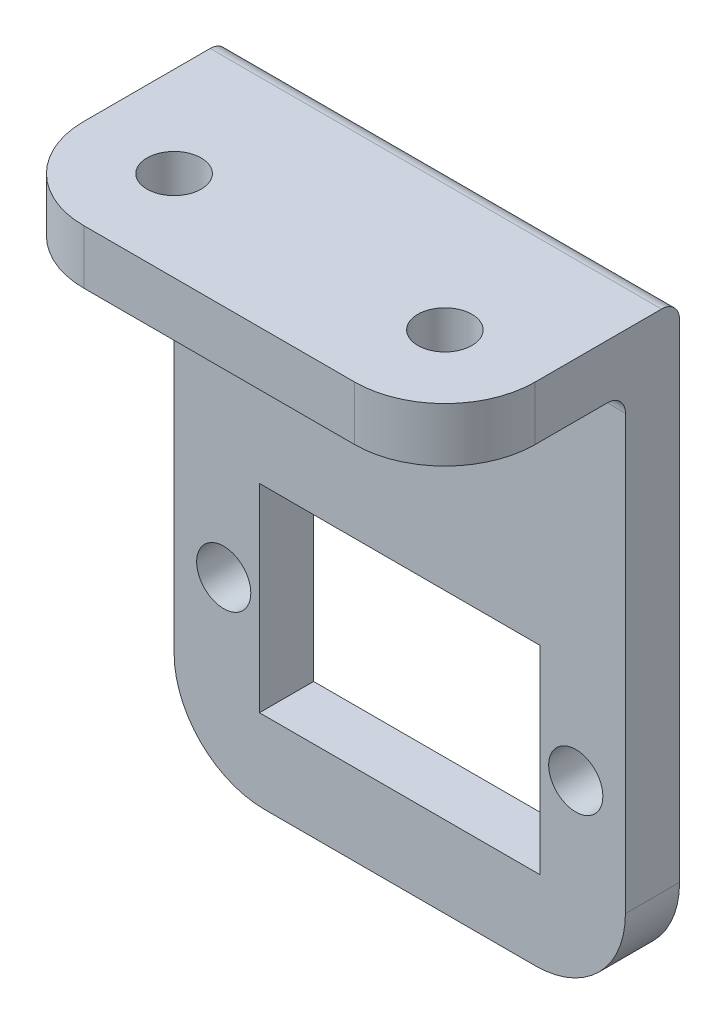
ISO-10303-21;
HEADER;
FILE_DESCRIPTION(('STEP AP214'),'2;1');
FILE_NAME('part.step','',(''),(''),'','','');
FILE_SCHEMA(('AUTOMOTIVE_DESIGN { 1 0 10303 214 1 1 1 1 }'));
ENDSEC;
DATA;
#1=APPLICATION_CONTEXT('core data for automotive mechanical design processes');
#2=APPLICATION_PROTOCOL_DEFINITION('international standard','automotive_design',2000,#1);
#3=PRODUCT_CONTEXT('',#1,'mechanical');
#4=PRODUCT('Part','Part','',(#3));
#5=PRODUCT_RELATED_PRODUCT_CATEGORY('part','',(#4));
#6=PRODUCT_DEFINITION_FORMATION('','',#4);
#7=PRODUCT_DEFINITION_CONTEXT('part definition',#1,'design');
#8=PRODUCT_DEFINITION('design','',#6,#7);
#9=PRODUCT_DEFINITION_SHAPE('','',#8);
#10=(LENGTH_UNIT() NAMED_UNIT(*) SI_UNIT(.MILLI.,.METRE.));
#11=(NAMED_UNIT(*) PLANE_ANGLE_UNIT() SI_UNIT($,.RADIAN.));
#12=(NAMED_UNIT(*) SI_UNIT($,.STERADIAN.) SOLID_ANGLE_UNIT());
#13=UNCERTAINTY_MEASURE_WITH_UNIT(LENGTH_MEASURE(1.E-05),#10,'distance_accuracy_value','');
#14=(GEOMETRIC_REPRESENTATION_CONTEXT(3) GLOBAL_UNCERTAINTY_ASSIGNED_CONTEXT((#13)) GLOBAL_UNIT_ASSIGNED_CONTEXT((#10,
#11,#12)) REPRESENTATION_CONTEXT('',''));
#15=CARTESIAN_POINT('',(0.,0.,0.));
#16=DIRECTION('',(0.,0.,1.));
#17=DIRECTION('',(1.,0.,0.));
#18=AXIS2_PLACEMENT_3D('',#15,#16,#17);
#19=CARTESIAN_POINT('',(0.,0.,3.));
#20=DIRECTION('',(0.,0.,-1.));
#21=DIRECTION('',(-1.,0.,0.));
#22=AXIS2_PLACEMENT_3D('',#19,#20,#21);
#23=PLANE('',#22);
#24=CARTESIAN_POINT('',(9.75,-5.,3.));
#25=DIRECTION('',(0.,0.,1.));
#26=DIRECTION('',(1.,0.,0.));
#27=AXIS2_PLACEMENT_3D('',#24,#25,#26);
#28=CIRCLE('',#27,1.5);
#29=CARTESIAN_POINT('',(11.25,-5.,3.));
#30=VERTEX_POINT('',#29);
#31=EDGE_CURVE('E196',#30,#30,#28,.T.);
#32=ORIENTED_EDGE('',*,*,#31,.F.);
#33=EDGE_LOOP('',(#32));
#34=FACE_BOUND('',#33,.T.);
#35=CARTESIAN_POINT('',(-9.75,-5.,3.));
#36=DIRECTION('',(0.,0.,1.));
#37=DIRECTION('',(1.,0.,0.));
#38=AXIS2_PLACEMENT_3D('',#35,#36,#37);
#39=CIRCLE('',#38,1.5);
#40=CARTESIAN_POINT('',(-8.25,-5.,3.));
#41=VERTEX_POINT('',#40);
#42=EDGE_CURVE('E202',#41,#41,#39,.T.);
#43=ORIENTED_EDGE('',*,*,#42,.F.);
#44=EDGE_LOOP('',(#43));
#45=FACE_BOUND('',#44,.T.);
#46=DIRECTION('',(1.,0.,0.));
#47=VECTOR('',#46,1.);
#48=CARTESIAN_POINT('',(-7.77000000000001,-10.5,3.));
#49=LINE('',#48,#47);
#50=CARTESIAN_POINT('',(-7.77000000000001,-10.5,3.));
#51=VERTEX_POINT('',#50);
#52=CARTESIAN_POINT('',(7.76999999999999,-10.5,3.));
#53=VERTEX_POINT('',#52);
#54=EDGE_CURVE('E186',#51,#53,#49,.T.);
#55=ORIENTED_EDGE('',*,*,#54,.F.);
#56=DIRECTION('',(0.,-1.,0.));
#57=VECTOR('',#56,1.);
#58=CARTESIAN_POINT('',(-7.77000000000001,0.500000000000002,3.));
#59=LINE('',#58,#57);
#60=CARTESIAN_POINT('',(-7.77000000000001,0.500000000000002,3.));
#61=VERTEX_POINT('',#60);
#62=EDGE_CURVE('E156',#61,#51,#59,.T.);
#63=ORIENTED_EDGE('',*,*,#62,.F.);
#64=DIRECTION('',(-1.,0.,0.));
#65=VECTOR('',#64,1.);
#66=CARTESIAN_POINT('',(-7.77000000000001,0.500000000000002,3.));
#67=LINE('',#66,#65);
#68=CARTESIAN_POINT('',(7.76999999999999,0.500000000000002,3.));
#69=VERTEX_POINT('',#68);
#70=EDGE_CURVE('E174',#69,#61,#67,.T.);
#71=ORIENTED_EDGE('',*,*,#70,.F.);
#72=DIRECTION('',(0.,1.,0.));
#73=VECTOR('',#72,1.);
#74=CARTESIAN_POINT('',(7.76999999999999,0.500000000000002,3.));
#75=LINE('',#74,#73);
#76=EDGE_CURVE('E177',#53,#69,#75,.T.);
#77=ORIENTED_EDGE('',*,*,#76,.F.);
#78=EDGE_LOOP('',(#55,#63,#71,#77));
#79=FACE_BOUND('',#78,.T.);
#80=DIRECTION('',(0.,1.,0.));
#81=VECTOR('',#80,1.);
#82=CARTESIAN_POINT('',(12.5,-15.,3.));
#83=LINE('',#82,#81);
#84=CARTESIAN_POINT('',(12.5,-10.,3.));
#85=VERTEX_POINT('',#84);
#86=CARTESIAN_POINT('',(12.5,14.,3.));
#87=VERTEX_POINT('',#86);
#88=EDGE_CURVE('E208',#85,#87,#83,.T.);
#89=ORIENTED_EDGE('',*,*,#88,.T.);
#90=DIRECTION('',(1.,0.,0.));
#91=VECTOR('',#90,1.);
#92=CARTESIAN_POINT('',(-12.5,14.,3.));
#93=LINE('',#92,#91);
#94=CARTESIAN_POINT('',(-12.5,14.,3.));
#95=VERTEX_POINT('',#94);
#96=EDGE_CURVE('E265',#87,#95,#93,.F.);
#97=ORIENTED_EDGE('',*,*,#96,.T.);
#98=DIRECTION('',(0.,-1.,0.));
#99=VECTOR('',#98,1.);
#100=CARTESIAN_POINT('',(-12.5,-15.,3.));
#101=LINE('',#100,#99);
#102=CARTESIAN_POINT('',(-12.5,-10.,3.));
#103=VERTEX_POINT('',#102);
#104=EDGE_CURVE('E211',#95,#103,#101,.T.);
#105=ORIENTED_EDGE('',*,*,#104,.T.);
#106=CARTESIAN_POINT('',(-7.5,-10.,3.));
#107=DIRECTION('',(0.,0.,-1.));
#108=DIRECTION('',(-1.,0.,0.));
#109=AXIS2_PLACEMENT_3D('',#106,#107,#108);
#110=CIRCLE('',#109,5.);
#111=CARTESIAN_POINT('',(-7.5,-15.,3.));
#112=VERTEX_POINT('',#111);
#113=EDGE_CURVE('E235',#103,#112,#110,.F.);
#114=ORIENTED_EDGE('',*,*,#113,.T.);
#115=DIRECTION('',(1.,0.,0.));
#116=VECTOR('',#115,1.);
#117=CARTESIAN_POINT('',(-12.5,-15.,3.));
#118=LINE('',#117,#116);
#119=CARTESIAN_POINT('',(7.5,-15.,3.));
#120=VERTEX_POINT('',#119);
#121=EDGE_CURVE('E214',#112,#120,#118,.T.);
#122=ORIENTED_EDGE('',*,*,#121,.T.);
#123=CARTESIAN_POINT('',(7.5,-10.,3.));
#124=DIRECTION('',(0.,0.,-1.));
#125=DIRECTION('',(-1.,0.,0.));
#126=AXIS2_PLACEMENT_3D('',#123,#124,#125);
#127=CIRCLE('',#126,5.);
#128=EDGE_CURVE('E237',#120,#85,#127,.F.);
#129=ORIENTED_EDGE('',*,*,#128,.T.);
#130=EDGE_LOOP('',(#89,#97,#105,#114,#122,#129));
#131=FACE_BOUND('',#130,.T.);
#132=ADVANCED_FACE('F37',(#34,#45,#79,#131),#23,.F.);
#133=CARTESIAN_POINT('',(0.,0.,0.));
#134=DIRECTION('',(0.,0.,-1.));
#135=DIRECTION('',(-1.,0.,0.));
#136=AXIS2_PLACEMENT_3D('',#133,#134,#135);
#137=PLANE('',#136);
#138=DIRECTION('',(0.,-1.,0.));
#139=VECTOR('',#138,1.);
#140=CARTESIAN_POINT('',(-7.77000000000001,0.500000000000002,0.));
#141=LINE('',#140,#139);
#142=CARTESIAN_POINT('',(-7.77000000000001,0.500000000000002,0.));
#143=VERTEX_POINT('',#142);
#144=CARTESIAN_POINT('',(-7.77000000000001,-10.5,0.));
#145=VERTEX_POINT('',#144);
#146=EDGE_CURVE('E153',#143,#145,#141,.T.);
#147=ORIENTED_EDGE('',*,*,#146,.T.);
#148=DIRECTION('',(1.,0.,0.));
#149=VECTOR('',#148,1.);
#150=CARTESIAN_POINT('',(-7.77000000000001,-10.5,0.));
#151=LINE('',#150,#149);
#152=CARTESIAN_POINT('',(7.76999999999999,-10.5,0.));
#153=VERTEX_POINT('',#152);
#154=EDGE_CURVE('E165',#145,#153,#151,.T.);
#155=ORIENTED_EDGE('',*,*,#154,.T.);
#156=DIRECTION('',(0.,1.,0.));
#157=VECTOR('',#156,1.);
#158=CARTESIAN_POINT('',(7.76999999999999,0.500000000000002,0.));
#159=LINE('',#158,#157);
#160=CARTESIAN_POINT('',(7.76999999999999,0.500000000000002,0.));
#161=VERTEX_POINT('',#160);
#162=EDGE_CURVE('E169',#153,#161,#159,.T.);
#163=ORIENTED_EDGE('',*,*,#162,.T.);
#164=DIRECTION('',(-1.,0.,0.));
#165=VECTOR('',#164,1.);
#166=CARTESIAN_POINT('',(-7.77000000000001,0.500000000000002,0.));
#167=LINE('',#166,#165);
#168=EDGE_CURVE('E161',#161,#143,#167,.T.);
#169=ORIENTED_EDGE('',*,*,#168,.T.);
#170=EDGE_LOOP('',(#147,#155,#163,#169));
#171=FACE_BOUND('',#170,.T.);
#172=CARTESIAN_POINT('',(-9.75,-5.,0.));
#173=DIRECTION('',(0.,0.,1.));
#174=DIRECTION('',(1.,0.,0.));
#175=AXIS2_PLACEMENT_3D('',#172,#173,#174);
#176=CIRCLE('',#175,1.5);
#177=CARTESIAN_POINT('',(-8.25,-5.,0.));
#178=VERTEX_POINT('',#177);
#179=EDGE_CURVE('E199',#178,#178,#176,.T.);
#180=ORIENTED_EDGE('',*,*,#179,.T.);
#181=EDGE_LOOP('',(#180));
#182=FACE_BOUND('',#181,.T.);
#183=DIRECTION('',(0.,-1.,0.));
#184=VECTOR('',#183,1.);
#185=CARTESIAN_POINT('',(-12.5,-15.,0.));
#186=LINE('',#185,#184);
#187=CARTESIAN_POINT('',(-12.5,17.,0.));
#188=VERTEX_POINT('',#187);
#189=CARTESIAN_POINT('',(-12.5,-10.,0.));
#190=VERTEX_POINT('',#189);
#191=EDGE_CURVE('E219',#188,#190,#186,.T.);
#192=ORIENTED_EDGE('',*,*,#191,.F.);
#193=DIRECTION('',(-1.,0.,0.));
#194=VECTOR('',#193,1.);
#195=CARTESIAN_POINT('',(0.,17.,0.));
#196=LINE('',#195,#194);
#197=CARTESIAN_POINT('',(12.5,17.,0.));
#198=VERTEX_POINT('',#197);
#199=EDGE_CURVE('E45',#188,#198,#196,.F.);
#200=ORIENTED_EDGE('',*,*,#199,.T.);
#201=DIRECTION('',(0.,1.,0.));
#202=VECTOR('',#201,1.);
#203=CARTESIAN_POINT('',(12.5,-15.,0.));
#204=LINE('',#203,#202);
#205=CARTESIAN_POINT('',(12.5,-10.,0.));
#206=VERTEX_POINT('',#205);
#207=EDGE_CURVE('E205',#206,#198,#204,.T.);
#208=ORIENTED_EDGE('',*,*,#207,.F.);
#209=CARTESIAN_POINT('',(7.5,-10.,0.));
#210=DIRECTION('',(0.,0.,-1.));
#211=DIRECTION('',(-1.,0.,0.));
#212=AXIS2_PLACEMENT_3D('',#209,#210,#211);
#213=CIRCLE('',#212,5.);
#214=CARTESIAN_POINT('',(7.5,-15.,0.));
#215=VERTEX_POINT('',#214);
#216=EDGE_CURVE('E228',#206,#215,#213,.T.);
#217=ORIENTED_EDGE('',*,*,#216,.T.);
#218=DIRECTION('',(1.,0.,0.));
#219=VECTOR('',#218,1.);
#220=CARTESIAN_POINT('',(-12.5,-15.,0.));
#221=LINE('',#220,#219);
#222=CARTESIAN_POINT('',(-7.5,-15.,0.));
#223=VERTEX_POINT('',#222);
#224=EDGE_CURVE('E212',#223,#215,#221,.T.);
#225=ORIENTED_EDGE('',*,*,#224,.F.);
#226=CARTESIAN_POINT('',(-7.5,-10.,0.));
#227=DIRECTION('',(0.,0.,-1.));
#228=DIRECTION('',(-1.,0.,0.));
#229=AXIS2_PLACEMENT_3D('',#226,#227,#228);
#230=CIRCLE('',#229,5.);
#231=EDGE_CURVE('E225',#223,#190,#230,.T.);
#232=ORIENTED_EDGE('',*,*,#231,.T.);
#233=EDGE_LOOP('',(#192,#200,#208,#217,#225,#232));
#234=FACE_BOUND('',#233,.T.);
#235=CARTESIAN_POINT('',(9.75,-5.,0.));
#236=DIRECTION('',(0.,0.,1.));
#237=DIRECTION('',(1.,0.,0.));
#238=AXIS2_PLACEMENT_3D('',#235,#236,#237);
#239=CIRCLE('',#238,1.5);
#240=CARTESIAN_POINT('',(11.25,-5.,0.));
#241=VERTEX_POINT('',#240);
#242=EDGE_CURVE('E192',#241,#241,#239,.T.);
#243=ORIENTED_EDGE('',*,*,#242,.T.);
#244=EDGE_LOOP('',(#243));
#245=FACE_BOUND('',#244,.T.);
#246=ADVANCED_FACE('F171',(#171,#182,#234,#245),#137,.T.);
#247=CARTESIAN_POINT('',(12.5,-15.,3.));
#248=DIRECTION('',(-1.,0.,0.));
#249=DIRECTION('',(0.,0.,1.));
#250=AXIS2_PLACEMENT_3D('',#247,#248,#249);
#251=PLANE('',#250);
#252=ORIENTED_EDGE('',*,*,#207,.T.);
#253=CARTESIAN_POINT('',(12.5,17.,1.));
#254=DIRECTION('',(-1.,0.,0.));
#255=DIRECTION('',(0.,0.,1.));
#256=AXIS2_PLACEMENT_3D('',#253,#254,#255);
#257=CIRCLE('',#256,1.);
#258=CARTESIAN_POINT('',(12.5,18.,1.));
#259=VERTEX_POINT('',#258);
#260=EDGE_CURVE('E11',#198,#259,#257,.F.);
#261=ORIENTED_EDGE('',*,*,#260,.T.);
#262=DIRECTION('',(0.,0.,-1.));
#263=VECTOR('',#262,1.);
#264=CARTESIAN_POINT('',(12.5,18.,3.));
#265=LINE('',#264,#263);
#266=CARTESIAN_POINT('',(12.5,18.,8.));
#267=VERTEX_POINT('',#266);
#268=EDGE_CURVE('E279',#267,#259,#265,.T.);
#269=ORIENTED_EDGE('',*,*,#268,.F.);
#270=DIRECTION('',(0.,1.,0.));
#271=VECTOR('',#270,1.);
#272=CARTESIAN_POINT('',(12.5,15.,8.));
#273=LINE('',#272,#271);
#274=CARTESIAN_POINT('',(12.5,15.,8.));
#275=VERTEX_POINT('',#274);
#276=EDGE_CURVE('E247',#267,#275,#273,.F.);
#277=ORIENTED_EDGE('',*,*,#276,.T.);
#278=DIRECTION('',(0.,0.,-1.));
#279=VECTOR('',#278,1.);
#280=CARTESIAN_POINT('',(12.5,15.,13.));
#281=LINE('',#280,#279);
#282=CARTESIAN_POINT('',(12.5,15.,4.));
#283=VERTEX_POINT('',#282);
#284=EDGE_CURVE('E288',#275,#283,#281,.T.);
#285=ORIENTED_EDGE('',*,*,#284,.T.);
#286=CARTESIAN_POINT('',(12.5,14.,4.));
#287=DIRECTION('',(-1.,0.,0.));
#288=DIRECTION('',(0.,0.,1.));
#289=AXIS2_PLACEMENT_3D('',#286,#287,#288);
#290=CIRCLE('',#289,1.);
#291=EDGE_CURVE('E267',#283,#87,#290,.T.);
#292=ORIENTED_EDGE('',*,*,#291,.T.);
#293=ORIENTED_EDGE('',*,*,#88,.F.);
#294=DIRECTION('',(0.,0.,-1.));
#295=VECTOR('',#294,1.);
#296=CARTESIAN_POINT('',(12.5,-10.,3.));
#297=LINE('',#296,#295);
#298=EDGE_CURVE('E217',#85,#206,#297,.T.);
#299=ORIENTED_EDGE('',*,*,#298,.T.);
#300=EDGE_LOOP('',(#252,#261,#269,#277,#285,#292,#293,#299));
#301=FACE_BOUND('',#300,.T.);
#302=ADVANCED_FACE('F336',(#301),#251,.F.);
#303=CARTESIAN_POINT('',(-12.5,-15.,3.));
#304=DIRECTION('',(1.,0.,0.));
#305=DIRECTION('',(0.,0.,-1.));
#306=AXIS2_PLACEMENT_3D('',#303,#304,#305);
#307=PLANE('',#306);
#308=DIRECTION('',(0.,0.,1.));
#309=VECTOR('',#308,1.);
#310=CARTESIAN_POINT('',(-12.5,18.,0.));
#311=LINE('',#310,#309);
#312=CARTESIAN_POINT('',(-12.5,18.,1.));
#313=VERTEX_POINT('',#312);
#314=CARTESIAN_POINT('',(-12.5,18.,8.));
#315=VERTEX_POINT('',#314);
#316=EDGE_CURVE('E180',#313,#315,#311,.T.);
#317=ORIENTED_EDGE('',*,*,#316,.F.);
#318=CARTESIAN_POINT('',(-12.5,17.,1.));
#319=DIRECTION('',(1.,0.,0.));
#320=DIRECTION('',(0.,0.,-1.));
#321=AXIS2_PLACEMENT_3D('',#318,#319,#320);
#322=CIRCLE('',#321,1.);
#323=EDGE_CURVE('E59',#313,#188,#322,.F.);
#324=ORIENTED_EDGE('',*,*,#323,.T.);
#325=ORIENTED_EDGE('',*,*,#191,.T.);
#326=DIRECTION('',(0.,0.,-1.));
#327=VECTOR('',#326,1.);
#328=CARTESIAN_POINT('',(-12.5,-10.,3.));
#329=LINE('',#328,#327);
#330=EDGE_CURVE('E239',#190,#103,#329,.F.);
#331=ORIENTED_EDGE('',*,*,#330,.T.);
#332=ORIENTED_EDGE('',*,*,#104,.F.);
#333=CARTESIAN_POINT('',(-12.5,14.,4.));
#334=DIRECTION('',(1.,0.,0.));
#335=DIRECTION('',(0.,0.,-1.));
#336=AXIS2_PLACEMENT_3D('',#333,#334,#335);
#337=CIRCLE('',#336,1.);
#338=CARTESIAN_POINT('',(-12.5,15.,4.));
#339=VERTEX_POINT('',#338);
#340=EDGE_CURVE('E269',#95,#339,#337,.T.);
#341=ORIENTED_EDGE('',*,*,#340,.T.);
#342=DIRECTION('',(0.,0.,-1.));
#343=VECTOR('',#342,1.);
#344=CARTESIAN_POINT('',(-12.5,15.,13.));
#345=LINE('',#344,#343);
#346=CARTESIAN_POINT('',(-12.5,15.,8.));
#347=VERTEX_POINT('',#346);
#348=EDGE_CURVE('E286',#347,#339,#345,.T.);
#349=ORIENTED_EDGE('',*,*,#348,.F.);
#350=DIRECTION('',(0.,-1.,0.));
#351=VECTOR('',#350,1.);
#352=CARTESIAN_POINT('',(-12.5,18.,8.));
#353=LINE('',#352,#351);
#354=EDGE_CURVE('E257',#347,#315,#353,.F.);
#355=ORIENTED_EDGE('',*,*,#354,.T.);
#356=EDGE_LOOP('',(#317,#324,#325,#331,#332,#341,#349,#355));
#357=FACE_BOUND('',#356,.T.);
#358=ADVANCED_FACE('F282',(#357),#307,.F.);
#359=CARTESIAN_POINT('',(-12.5,-15.,3.));
#360=DIRECTION('',(0.,1.,0.));
#361=DIRECTION('',(0.,0.,1.));
#362=AXIS2_PLACEMENT_3D('',#359,#360,#361);
#363=PLANE('',#362);
#364=ORIENTED_EDGE('',*,*,#224,.T.);
#365=DIRECTION('',(0.,0.,-1.));
#366=VECTOR('',#365,1.);
#367=CARTESIAN_POINT('',(7.5,-15.,3.));
#368=LINE('',#367,#366);
#369=EDGE_CURVE('E233',#215,#120,#368,.F.);
#370=ORIENTED_EDGE('',*,*,#369,.T.);
#371=ORIENTED_EDGE('',*,*,#121,.F.);
#372=DIRECTION('',(0.,0.,-1.));
#373=VECTOR('',#372,1.);
#374=CARTESIAN_POINT('',(-7.5,-15.,3.));
#375=LINE('',#374,#373);
#376=EDGE_CURVE('E230',#112,#223,#375,.T.);
#377=ORIENTED_EDGE('',*,*,#376,.T.);
#378=EDGE_LOOP('',(#364,#370,#371,#377));
#379=FACE_BOUND('',#378,.T.);
#380=ADVANCED_FACE('F348',(#379),#363,.F.);
#381=CARTESIAN_POINT('',(-9.75,-5.,3.));
#382=DIRECTION('',(0.,0.,-1.));
#383=DIRECTION('',(-1.,0.,0.));
#384=AXIS2_PLACEMENT_3D('',#381,#382,#383);
#385=CYLINDRICAL_SURFACE('',#384,1.5);
#386=ORIENTED_EDGE('',*,*,#42,.T.);
#387=EDGE_LOOP('',(#386));
#388=FACE_BOUND('',#387,.T.);
#389=ORIENTED_EDGE('',*,*,#179,.F.);
#390=EDGE_LOOP('',(#389));
#391=FACE_BOUND('',#390,.T.);
#392=ADVANCED_FACE('F383',(#388,#391),#385,.F.);
#393=CARTESIAN_POINT('',(9.75,-5.,3.));
#394=DIRECTION('',(0.,0.,-1.));
#395=DIRECTION('',(-1.,0.,0.));
#396=AXIS2_PLACEMENT_3D('',#393,#394,#395);
#397=CYLINDRICAL_SURFACE('',#396,1.5);
#398=ORIENTED_EDGE('',*,*,#31,.T.);
#399=EDGE_LOOP('',(#398));
#400=FACE_BOUND('',#399,.T.);
#401=ORIENTED_EDGE('',*,*,#242,.F.);
#402=EDGE_LOOP('',(#401));
#403=FACE_BOUND('',#402,.T.);
#404=ADVANCED_FACE('F414',(#400,#403),#397,.F.);
#405=CARTESIAN_POINT('',(-7.77000000000001,0.500000000000002,0.));
#406=DIRECTION('',(-1.,0.,0.));
#407=DIRECTION('',(0.,-1.,0.));
#408=AXIS2_PLACEMENT_3D('',#405,#406,#407);
#409=PLANE('',#408);
#410=ORIENTED_EDGE('',*,*,#62,.T.);
#411=DIRECTION('',(0.,0.,1.));
#412=VECTOR('',#411,1.);
#413=CARTESIAN_POINT('',(-7.77000000000001,-10.5,0.));
#414=LINE('',#413,#412);
#415=EDGE_CURVE('E149',#145,#51,#414,.T.);
#416=ORIENTED_EDGE('',*,*,#415,.F.);
#417=ORIENTED_EDGE('',*,*,#146,.F.);
#418=DIRECTION('',(0.,0.,1.));
#419=VECTOR('',#418,1.);
#420=CARTESIAN_POINT('',(-7.77000000000001,0.500000000000002,0.));
#421=LINE('',#420,#419);
#422=EDGE_CURVE('E190',#143,#61,#421,.T.);
#423=ORIENTED_EDGE('',*,*,#422,.T.);
#424=EDGE_LOOP('',(#410,#416,#417,#423));
#425=FACE_BOUND('',#424,.T.);
#426=ADVANCED_FACE('F151',(#425),#409,.F.);
#427=CARTESIAN_POINT('',(-7.77000000000001,0.500000000000002,0.));
#428=DIRECTION('',(0.,1.,0.));
#429=DIRECTION('',(0.,0.,1.));
#430=AXIS2_PLACEMENT_3D('',#427,#428,#429);
#431=PLANE('',#430);
#432=ORIENTED_EDGE('',*,*,#70,.T.);
#433=ORIENTED_EDGE('',*,*,#422,.F.);
#434=ORIENTED_EDGE('',*,*,#168,.F.);
#435=DIRECTION('',(0.,0.,1.));
#436=VECTOR('',#435,1.);
#437=CARTESIAN_POINT('',(7.76999999999999,0.500000000000002,0.));
#438=LINE('',#437,#436);
#439=EDGE_CURVE('E193',#161,#69,#438,.T.);
#440=ORIENTED_EDGE('',*,*,#439,.T.);
#441=EDGE_LOOP('',(#432,#433,#434,#440));
#442=FACE_BOUND('',#441,.T.);
#443=ADVANCED_FACE('F403',(#442),#431,.F.);
#444=CARTESIAN_POINT('',(7.76999999999999,0.500000000000002,0.));
#445=DIRECTION('',(1.,0.,0.));
#446=DIRECTION('',(0.,1.,0.));
#447=AXIS2_PLACEMENT_3D('',#444,#445,#446);
#448=PLANE('',#447);
#449=ORIENTED_EDGE('',*,*,#76,.T.);
#450=ORIENTED_EDGE('',*,*,#439,.F.);
#451=ORIENTED_EDGE('',*,*,#162,.F.);
#452=DIRECTION('',(0.,0.,1.));
#453=VECTOR('',#452,1.);
#454=CARTESIAN_POINT('',(7.76999999999999,-10.5,0.));
#455=LINE('',#454,#453);
#456=EDGE_CURVE('E160',#153,#53,#455,.T.);
#457=ORIENTED_EDGE('',*,*,#456,.T.);
#458=EDGE_LOOP('',(#449,#450,#451,#457));
#459=FACE_BOUND('',#458,.T.);
#460=ADVANCED_FACE('F406',(#459),#448,.F.);
#461=CARTESIAN_POINT('',(-7.77000000000001,-10.5,0.));
#462=DIRECTION('',(0.,-1.,0.));
#463=DIRECTION('',(0.,0.,-1.));
#464=AXIS2_PLACEMENT_3D('',#461,#462,#463);
#465=PLANE('',#464);
#466=ORIENTED_EDGE('',*,*,#54,.T.);
#467=ORIENTED_EDGE('',*,*,#456,.F.);
#468=ORIENTED_EDGE('',*,*,#154,.F.);
#469=ORIENTED_EDGE('',*,*,#415,.T.);
#470=EDGE_LOOP('',(#466,#467,#468,#469));
#471=FACE_BOUND('',#470,.T.);
#472=ADVANCED_FACE('F166',(#471),#465,.F.);
#473=CARTESIAN_POINT('',(7.5,-10.,3.));
#474=DIRECTION('',(0.,0.,-1.));
#475=DIRECTION('',(-1.,0.,0.));
#476=AXIS2_PLACEMENT_3D('',#473,#474,#475);
#477=CYLINDRICAL_SURFACE('',#476,5.);
#478=ORIENTED_EDGE('',*,*,#128,.F.);
#479=ORIENTED_EDGE('',*,*,#369,.F.);
#480=ORIENTED_EDGE('',*,*,#216,.F.);
#481=ORIENTED_EDGE('',*,*,#298,.F.);
#482=EDGE_LOOP('',(#478,#479,#480,#481));
#483=FACE_BOUND('',#482,.T.);
#484=ADVANCED_FACE('F344',(#483),#477,.T.);
#485=CARTESIAN_POINT('',(-7.5,-10.,3.));
#486=DIRECTION('',(0.,0.,-1.));
#487=DIRECTION('',(-1.,0.,0.));
#488=AXIS2_PLACEMENT_3D('',#485,#486,#487);
#489=CYLINDRICAL_SURFACE('',#488,5.);
#490=ORIENTED_EDGE('',*,*,#113,.F.);
#491=ORIENTED_EDGE('',*,*,#330,.F.);
#492=ORIENTED_EDGE('',*,*,#231,.F.);
#493=ORIENTED_EDGE('',*,*,#376,.F.);
#494=EDGE_LOOP('',(#490,#491,#492,#493));
#495=FACE_BOUND('',#494,.T.);
#496=ADVANCED_FACE('F352',(#495),#489,.T.);
#497=CARTESIAN_POINT('',(0.,18.,0.));
#498=DIRECTION('',(0.,1.,0.));
#499=DIRECTION('',(0.,0.,1.));
#500=AXIS2_PLACEMENT_3D('',#497,#498,#499);
#501=PLANE('',#500);
#502=CARTESIAN_POINT('',(-7.5,18.,8.));
#503=DIRECTION('',(0.,-1.,0.));
#504=DIRECTION('',(0.,0.,-1.));
#505=AXIS2_PLACEMENT_3D('',#502,#503,#504);
#506=CIRCLE('',#505,1.5);
#507=CARTESIAN_POINT('',(-7.5,18.,6.5));
#508=VERTEX_POINT('',#507);
#509=EDGE_CURVE('E298',#508,#508,#506,.T.);
#510=ORIENTED_EDGE('',*,*,#509,.T.);
#511=EDGE_LOOP('',(#510));
#512=FACE_BOUND('',#511,.T.);
#513=CARTESIAN_POINT('',(7.5,18.,8.));
#514=DIRECTION('',(0.,-1.,0.));
#515=DIRECTION('',(0.,0.,-1.));
#516=AXIS2_PLACEMENT_3D('',#513,#514,#515);
#517=CIRCLE('',#516,1.5);
#518=CARTESIAN_POINT('',(7.5,18.,6.5));
#519=VERTEX_POINT('',#518);
#520=EDGE_CURVE('E299',#519,#519,#517,.T.);
#521=ORIENTED_EDGE('',*,*,#520,.T.);
#522=EDGE_LOOP('',(#521));
#523=FACE_BOUND('',#522,.T.);
#524=ORIENTED_EDGE('',*,*,#268,.T.);
#525=DIRECTION('',(-1.,0.,0.));
#526=VECTOR('',#525,1.);
#527=CARTESIAN_POINT('',(0.,18.,1.));
#528=LINE('',#527,#526);
#529=EDGE_CURVE('E271',#259,#313,#528,.T.);
#530=ORIENTED_EDGE('',*,*,#529,.T.);
#531=ORIENTED_EDGE('',*,*,#316,.T.);
#532=CARTESIAN_POINT('',(-7.5,18.,8.));
#533=DIRECTION('',(0.,1.,0.));
#534=DIRECTION('',(0.,0.,1.));
#535=AXIS2_PLACEMENT_3D('',#532,#533,#534);
#536=CIRCLE('',#535,5.);
#537=CARTESIAN_POINT('',(-7.5,18.,13.));
#538=VERTEX_POINT('',#537);
#539=EDGE_CURVE('E260',#315,#538,#536,.T.);
#540=ORIENTED_EDGE('',*,*,#539,.T.);
#541=DIRECTION('',(-1.,0.,0.));
#542=VECTOR('',#541,1.);
#543=CARTESIAN_POINT('',(-12.5,18.,13.));
#544=LINE('',#543,#542);
#545=CARTESIAN_POINT('',(7.5,18.,13.));
#546=VERTEX_POINT('',#545);
#547=EDGE_CURVE('E293',#546,#538,#544,.T.);
#548=ORIENTED_EDGE('',*,*,#547,.F.);
#549=CARTESIAN_POINT('',(7.5,18.,8.));
#550=DIRECTION('',(0.,1.,0.));
#551=DIRECTION('',(0.,0.,1.));
#552=AXIS2_PLACEMENT_3D('',#549,#550,#551);
#553=CIRCLE('',#552,5.);
#554=EDGE_CURVE('E245',#546,#267,#553,.T.);
#555=ORIENTED_EDGE('',*,*,#554,.T.);
#556=EDGE_LOOP('',(#524,#530,#531,#540,#548,#555));
#557=FACE_BOUND('',#556,.T.);
#558=ADVANCED_FACE('F277',(#512,#523,#557),#501,.T.);
#559=CARTESIAN_POINT('',(-12.5,15.,13.));
#560=DIRECTION('',(0.,1.,0.));
#561=DIRECTION('',(0.,0.,1.));
#562=AXIS2_PLACEMENT_3D('',#559,#560,#561);
#563=PLANE('',#562);
#564=CARTESIAN_POINT('',(-7.5,15.,8.));
#565=DIRECTION('',(0.,-1.,0.));
#566=DIRECTION('',(0.,0.,-1.));
#567=AXIS2_PLACEMENT_3D('',#564,#565,#566);
#568=CIRCLE('',#567,1.5);
#569=CARTESIAN_POINT('',(-7.5,15.,6.5));
#570=VERTEX_POINT('',#569);
#571=EDGE_CURVE('E305',#570,#570,#568,.T.);
#572=ORIENTED_EDGE('',*,*,#571,.F.);
#573=EDGE_LOOP('',(#572));
#574=FACE_BOUND('',#573,.T.);
#575=CARTESIAN_POINT('',(7.5,15.,8.));
#576=DIRECTION('',(0.,-1.,0.));
#577=DIRECTION('',(0.,0.,-1.));
#578=AXIS2_PLACEMENT_3D('',#575,#576,#577);
#579=CIRCLE('',#578,1.5);
#580=CARTESIAN_POINT('',(7.5,15.,6.5));
#581=VERTEX_POINT('',#580);
#582=EDGE_CURVE('E302',#581,#581,#579,.T.);
#583=ORIENTED_EDGE('',*,*,#582,.F.);
#584=EDGE_LOOP('',(#583));
#585=FACE_BOUND('',#584,.T.);
#586=ORIENTED_EDGE('',*,*,#348,.T.);
#587=DIRECTION('',(1.,0.,0.));
#588=VECTOR('',#587,1.);
#589=CARTESIAN_POINT('',(12.5,15.,4.));
#590=LINE('',#589,#588);
#591=EDGE_CURVE('E262',#339,#283,#590,.T.);
#592=ORIENTED_EDGE('',*,*,#591,.T.);
#593=ORIENTED_EDGE('',*,*,#284,.F.);
#594=CARTESIAN_POINT('',(7.5,15.,8.));
#595=DIRECTION('',(0.,1.,0.));
#596=DIRECTION('',(0.,0.,1.));
#597=AXIS2_PLACEMENT_3D('',#594,#595,#596);
#598=CIRCLE('',#597,5.);
#599=CARTESIAN_POINT('',(7.5,15.,13.));
#600=VERTEX_POINT('',#599);
#601=EDGE_CURVE('E249',#275,#600,#598,.F.);
#602=ORIENTED_EDGE('',*,*,#601,.T.);
#603=DIRECTION('',(1.,0.,0.));
#604=VECTOR('',#603,1.);
#605=CARTESIAN_POINT('',(-12.5,15.,13.));
#606=LINE('',#605,#604);
#607=CARTESIAN_POINT('',(-7.5,15.,13.));
#608=VERTEX_POINT('',#607);
#609=EDGE_CURVE('E296',#608,#600,#606,.T.);
#610=ORIENTED_EDGE('',*,*,#609,.F.);
#611=CARTESIAN_POINT('',(-7.5,15.,8.));
#612=DIRECTION('',(0.,1.,0.));
#613=DIRECTION('',(0.,0.,1.));
#614=AXIS2_PLACEMENT_3D('',#611,#612,#613);
#615=CIRCLE('',#614,5.);
#616=EDGE_CURVE('E255',#608,#347,#615,.F.);
#617=ORIENTED_EDGE('',*,*,#616,.T.);
#618=EDGE_LOOP('',(#586,#592,#593,#602,#610,#617));
#619=FACE_BOUND('',#618,.T.);
#620=ADVANCED_FACE('F321',(#574,#585,#619),#563,.F.);
#621=CARTESIAN_POINT('',(0.,0.,13.));
#622=DIRECTION('',(0.,0.,1.));
#623=DIRECTION('',(1.,0.,0.));
#624=AXIS2_PLACEMENT_3D('',#621,#622,#623);
#625=PLANE('',#624);
#626=ORIENTED_EDGE('',*,*,#547,.T.);
#627=DIRECTION('',(0.,-1.,0.));
#628=VECTOR('',#627,1.);
#629=CARTESIAN_POINT('',(-7.5,15.,13.));
#630=LINE('',#629,#628);
#631=EDGE_CURVE('E252',#538,#608,#630,.T.);
#632=ORIENTED_EDGE('',*,*,#631,.T.);
#633=ORIENTED_EDGE('',*,*,#609,.T.);
#634=DIRECTION('',(0.,1.,0.));
#635=VECTOR('',#634,1.);
#636=CARTESIAN_POINT('',(7.5,18.,13.));
#637=LINE('',#636,#635);
#638=EDGE_CURVE('E242',#600,#546,#637,.T.);
#639=ORIENTED_EDGE('',*,*,#638,.T.);
#640=EDGE_LOOP('',(#626,#632,#633,#639));
#641=FACE_BOUND('',#640,.T.);
#642=ADVANCED_FACE('F324',(#641),#625,.T.);
#643=CARTESIAN_POINT('',(7.5,0.,8.));
#644=DIRECTION('',(0.,-1.,0.));
#645=DIRECTION('',(0.,0.,-1.));
#646=AXIS2_PLACEMENT_3D('',#643,#644,#645);
#647=CYLINDRICAL_SURFACE('',#646,5.);
#648=ORIENTED_EDGE('',*,*,#601,.F.);
#649=ORIENTED_EDGE('',*,*,#276,.F.);
#650=ORIENTED_EDGE('',*,*,#554,.F.);
#651=ORIENTED_EDGE('',*,*,#638,.F.);
#652=EDGE_LOOP('',(#648,#649,#650,#651));
#653=FACE_BOUND('',#652,.T.);
#654=ADVANCED_FACE('F357',(#653),#647,.T.);
#655=CARTESIAN_POINT('',(-7.5,0.,8.));
#656=DIRECTION('',(0.,1.,0.));
#657=DIRECTION('',(0.,0.,1.));
#658=AXIS2_PLACEMENT_3D('',#655,#656,#657);
#659=CYLINDRICAL_SURFACE('',#658,5.);
#660=ORIENTED_EDGE('',*,*,#539,.F.);
#661=ORIENTED_EDGE('',*,*,#354,.F.);
#662=ORIENTED_EDGE('',*,*,#616,.F.);
#663=ORIENTED_EDGE('',*,*,#631,.F.);
#664=EDGE_LOOP('',(#660,#661,#662,#663));
#665=FACE_BOUND('',#664,.T.);
#666=ADVANCED_FACE('F363',(#665),#659,.T.);
#667=CARTESIAN_POINT('',(7.5,18.,8.));
#668=DIRECTION('',(0.,-1.,0.));
#669=DIRECTION('',(0.,0.,-1.));
#670=AXIS2_PLACEMENT_3D('',#667,#668,#669);
#671=CYLINDRICAL_SURFACE('',#670,1.5);
#672=ORIENTED_EDGE('',*,*,#520,.F.);
#673=EDGE_LOOP('',(#672));
#674=FACE_BOUND('',#673,.T.);
#675=ORIENTED_EDGE('',*,*,#582,.T.);
#676=EDGE_LOOP('',(#675));
#677=FACE_BOUND('',#676,.T.);
#678=ADVANCED_FACE('F317',(#674,#677),#671,.F.);
#679=CARTESIAN_POINT('',(-7.5,18.,8.));
#680=DIRECTION('',(0.,-1.,0.));
#681=DIRECTION('',(0.,0.,-1.));
#682=AXIS2_PLACEMENT_3D('',#679,#680,#681);
#683=CYLINDRICAL_SURFACE('',#682,1.5);
#684=ORIENTED_EDGE('',*,*,#509,.F.);
#685=EDGE_LOOP('',(#684));
#686=FACE_BOUND('',#685,.T.);
#687=ORIENTED_EDGE('',*,*,#571,.T.);
#688=EDGE_LOOP('',(#687));
#689=FACE_BOUND('',#688,.T.);
#690=ADVANCED_FACE('F313',(#686,#689),#683,.F.);
#691=CARTESIAN_POINT('',(-12.5,14.,4.));
#692=DIRECTION('',(-1.,0.,0.));
#693=DIRECTION('',(0.,0.,1.));
#694=AXIS2_PLACEMENT_3D('',#691,#692,#693);
#695=CYLINDRICAL_SURFACE('',#694,1.);
#696=ORIENTED_EDGE('',*,*,#340,.F.);
#697=ORIENTED_EDGE('',*,*,#96,.F.);
#698=ORIENTED_EDGE('',*,*,#291,.F.);
#699=ORIENTED_EDGE('',*,*,#591,.F.);
#700=EDGE_LOOP('',(#696,#697,#698,#699));
#701=FACE_BOUND('',#700,.T.);
#702=ADVANCED_FACE('F316',(#701),#695,.F.);
#703=CARTESIAN_POINT('',(0.,17.,1.));
#704=DIRECTION('',(-1.,0.,0.));
#705=DIRECTION('',(0.,0.,1.));
#706=AXIS2_PLACEMENT_3D('',#703,#704,#705);
#707=CYLINDRICAL_SURFACE('',#706,1.);
#708=ORIENTED_EDGE('',*,*,#260,.F.);
#709=ORIENTED_EDGE('',*,*,#199,.F.);
#710=ORIENTED_EDGE('',*,*,#323,.F.);
#711=ORIENTED_EDGE('',*,*,#529,.F.);
#712=EDGE_LOOP('',(#708,#709,#710,#711));
#713=FACE_BOUND('',#712,.T.);
#714=ADVANCED_FACE('F39',(#713),#707,.T.);
#715=CLOSED_SHELL('',(#132,#246,#302,#358,#380,#392,#404,#426,#443,#460,#472,#484,#496,#558,
#620,#642,#654,#666,#678,#690,#702,#714));
#716=MANIFOLD_SOLID_BREP('B2',#715);
#717=ADVANCED_BREP_SHAPE_REPRESENTATION('',(#18,#716),#14);
#718=SHAPE_DEFINITION_REPRESENTATION(#9,#717);
ENDSEC;
END-ISO-10303-21;
